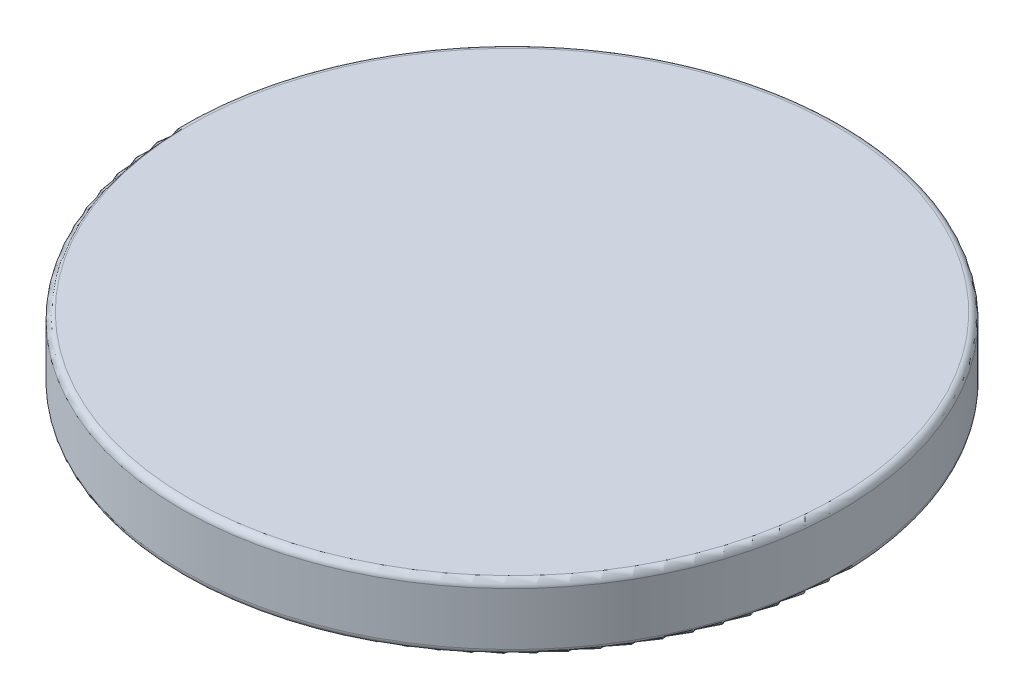
ISO-10303-21;
HEADER;
FILE_DESCRIPTION(('STEP AP214'),'2;1');
FILE_NAME('part.step','',(''),(''),'','','');
FILE_SCHEMA(('AUTOMOTIVE_DESIGN { 1 0 10303 214 1 1 1 1 }'));
ENDSEC;
DATA;
#1=APPLICATION_CONTEXT('core data for automotive mechanical design processes');
#2=APPLICATION_PROTOCOL_DEFINITION('international standard','automotive_design',2000,#1);
#3=PRODUCT_CONTEXT('',#1,'mechanical');
#4=PRODUCT('Part','Part','',(#3));
#5=PRODUCT_RELATED_PRODUCT_CATEGORY('part','',(#4));
#6=PRODUCT_DEFINITION_FORMATION('','',#4);
#7=PRODUCT_DEFINITION_CONTEXT('part definition',#1,'design');
#8=PRODUCT_DEFINITION('design','',#6,#7);
#9=PRODUCT_DEFINITION_SHAPE('','',#8);
#10=(LENGTH_UNIT() NAMED_UNIT(*) SI_UNIT(.MILLI.,.METRE.));
#11=(NAMED_UNIT(*) PLANE_ANGLE_UNIT() SI_UNIT($,.RADIAN.));
#12=(NAMED_UNIT(*) SI_UNIT($,.STERADIAN.) SOLID_ANGLE_UNIT());
#13=UNCERTAINTY_MEASURE_WITH_UNIT(LENGTH_MEASURE(1.E-05),#10,'distance_accuracy_value','');
#14=(GEOMETRIC_REPRESENTATION_CONTEXT(3) GLOBAL_UNCERTAINTY_ASSIGNED_CONTEXT((#13)) GLOBAL_UNIT_ASSIGNED_CONTEXT((#10,
#11,#12)) REPRESENTATION_CONTEXT('',''));
#15=CARTESIAN_POINT('',(0.,0.,0.));
#16=DIRECTION('',(0.,0.,1.));
#17=DIRECTION('',(1.,0.,0.));
#18=AXIS2_PLACEMENT_3D('',#15,#16,#17);
#19=CARTESIAN_POINT('',(0.,1.,0.));
#20=DIRECTION('',(0.,-1.,0.));
#21=DIRECTION('',(0.,0.,-1.));
#22=AXIS2_PLACEMENT_3D('',#19,#20,#21);
#23=CYLINDRICAL_SURFACE('',#22,10.);
#24=CARTESIAN_POINT('',(0.,-0.8,0.));
#25=DIRECTION('',(0.,1.,0.));
#26=DIRECTION('',(0.,0.,1.));
#27=AXIS2_PLACEMENT_3D('',#24,#25,#26);
#28=CIRCLE('',#27,10.);
#29=CARTESIAN_POINT('',(0.,-0.8,10.));
#30=VERTEX_POINT('',#29);
#31=EDGE_CURVE('E41',#30,#30,#28,.T.);
#32=ORIENTED_EDGE('',*,*,#31,.T.);
#33=EDGE_LOOP('',(#32));
#34=FACE_BOUND('',#33,.T.);
#35=CARTESIAN_POINT('',(0.,0.8,0.));
#36=DIRECTION('',(0.,1.,0.));
#37=DIRECTION('',(0.,0.,1.));
#38=AXIS2_PLACEMENT_3D('',#35,#36,#37);
#39=CIRCLE('',#38,10.);
#40=CARTESIAN_POINT('',(0.,0.8,10.));
#41=VERTEX_POINT('',#40);
#42=EDGE_CURVE('E45',#41,#41,#39,.F.);
#43=ORIENTED_EDGE('',*,*,#42,.T.);
#44=EDGE_LOOP('',(#43));
#45=FACE_BOUND('',#44,.T.);
#46=ADVANCED_FACE('F30',(#34,#45),#23,.T.);
#47=CARTESIAN_POINT('',(0.,1.,0.));
#48=DIRECTION('',(0.,1.,0.));
#49=DIRECTION('',(0.,0.,1.));
#50=AXIS2_PLACEMENT_3D('',#47,#48,#49);
#51=PLANE('',#50);
#52=CARTESIAN_POINT('',(0.,1.,0.));
#53=DIRECTION('',(0.,1.,0.));
#54=DIRECTION('',(0.,0.,1.));
#55=AXIS2_PLACEMENT_3D('',#52,#53,#54);
#56=CIRCLE('',#55,9.8);
#57=CARTESIAN_POINT('',(0.,1.,9.8));
#58=VERTEX_POINT('',#57);
#59=EDGE_CURVE('E10',#58,#58,#56,.T.);
#60=ORIENTED_EDGE('',*,*,#59,.T.);
#61=EDGE_LOOP('',(#60));
#62=FACE_BOUND('',#61,.T.);
#63=ADVANCED_FACE('F61',(#62),#51,.T.);
#64=CARTESIAN_POINT('',(0.,-1.,0.));
#65=DIRECTION('',(0.,1.,0.));
#66=DIRECTION('',(0.,0.,1.));
#67=AXIS2_PLACEMENT_3D('',#64,#65,#66);
#68=PLANE('',#67);
#69=CARTESIAN_POINT('',(0.,-1.,0.));
#70=DIRECTION('',(0.,1.,0.));
#71=DIRECTION('',(0.,0.,1.));
#72=AXIS2_PLACEMENT_3D('',#69,#70,#71);
#73=CIRCLE('',#72,9.8);
#74=CARTESIAN_POINT('',(0.,-1.,9.8));
#75=VERTEX_POINT('',#74);
#76=EDGE_CURVE('E37',#75,#75,#73,.F.);
#77=ORIENTED_EDGE('',*,*,#76,.T.);
#78=EDGE_LOOP('',(#77));
#79=FACE_BOUND('',#78,.T.);
#80=ADVANCED_FACE('F58',(#79),#68,.F.);
#81=CARTESIAN_POINT('',(0.,-0.8,0.));
#82=DIRECTION('',(0.,1.,0.));
#83=DIRECTION('',(0.,0.,1.));
#84=AXIS2_PLACEMENT_3D('',#81,#82,#83);
#85=TOROIDAL_SURFACE('',#84,9.8,0.2);
#86=ORIENTED_EDGE('',*,*,#76,.F.);
#87=EDGE_LOOP('',(#86));
#88=FACE_BOUND('',#87,.T.);
#89=ORIENTED_EDGE('',*,*,#31,.F.);
#90=EDGE_LOOP('',(#89));
#91=FACE_BOUND('',#90,.T.);
#92=ADVANCED_FACE('F54',(#88,#91),#85,.T.);
#93=CARTESIAN_POINT('',(0.,0.8,0.));
#94=DIRECTION('',(0.,1.,0.));
#95=DIRECTION('',(0.,0.,1.));
#96=AXIS2_PLACEMENT_3D('',#93,#94,#95);
#97=TOROIDAL_SURFACE('',#96,9.8,0.2);
#98=ORIENTED_EDGE('',*,*,#42,.F.);
#99=EDGE_LOOP('',(#98));
#100=FACE_BOUND('',#99,.T.);
#101=ORIENTED_EDGE('',*,*,#59,.F.);
#102=EDGE_LOOP('',(#101));
#103=FACE_BOUND('',#102,.T.);
#104=ADVANCED_FACE('F32',(#100,#103),#97,.T.);
#105=CLOSED_SHELL('',(#46,#63,#80,#92,#104));
#106=MANIFOLD_SOLID_BREP('B2',#105);
#107=ADVANCED_BREP_SHAPE_REPRESENTATION('',(#18,#106),#14);
#108=SHAPE_DEFINITION_REPRESENTATION(#9,#107);
ENDSEC;
END-ISO-10303-21;
